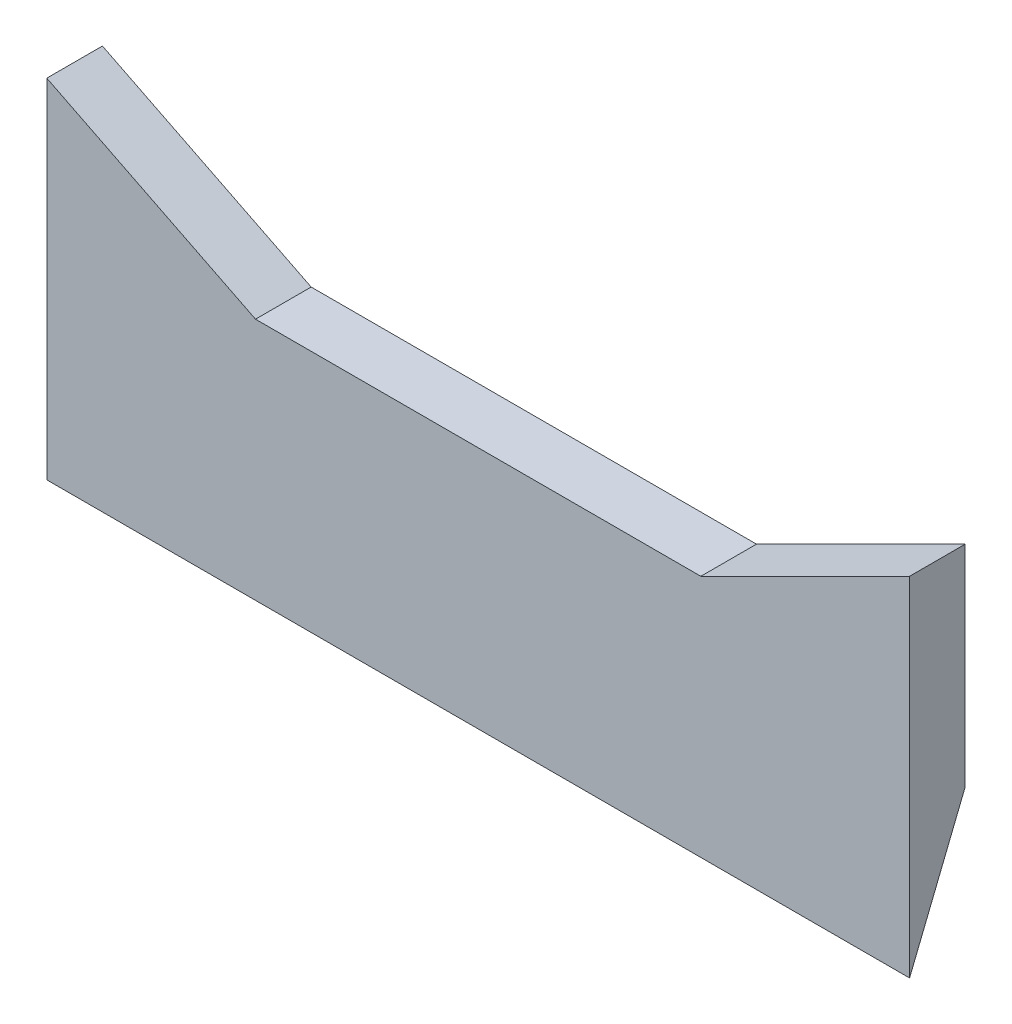
ISO-10303-21;
HEADER;
FILE_DESCRIPTION(('STEP AP214'),'2;1');
FILE_NAME('part.step','',(''),(''),'','','');
FILE_SCHEMA(('AUTOMOTIVE_DESIGN { 1 0 10303 214 1 1 1 1 }'));
ENDSEC;
DATA;
#1=APPLICATION_CONTEXT('core data for automotive mechanical design processes');
#2=APPLICATION_PROTOCOL_DEFINITION('international standard','automotive_design',2000,#1);
#3=PRODUCT_CONTEXT('',#1,'mechanical');
#4=PRODUCT('Part','Part','',(#3));
#5=PRODUCT_RELATED_PRODUCT_CATEGORY('part','',(#4));
#6=PRODUCT_DEFINITION_FORMATION('','',#4);
#7=PRODUCT_DEFINITION_CONTEXT('part definition',#1,'design');
#8=PRODUCT_DEFINITION('design','',#6,#7);
#9=PRODUCT_DEFINITION_SHAPE('','',#8);
#10=(LENGTH_UNIT() NAMED_UNIT(*) SI_UNIT(.MILLI.,.METRE.));
#11=(NAMED_UNIT(*) PLANE_ANGLE_UNIT() SI_UNIT($,.RADIAN.));
#12=(NAMED_UNIT(*) SI_UNIT($,.STERADIAN.) SOLID_ANGLE_UNIT());
#13=UNCERTAINTY_MEASURE_WITH_UNIT(LENGTH_MEASURE(1.E-05),#10,'distance_accuracy_value','');
#14=(GEOMETRIC_REPRESENTATION_CONTEXT(3) GLOBAL_UNCERTAINTY_ASSIGNED_CONTEXT((#13)) GLOBAL_UNIT_ASSIGNED_CONTEXT((#10,
#11,#12)) REPRESENTATION_CONTEXT('',''));
#15=CARTESIAN_POINT('',(0.,0.,0.));
#16=DIRECTION('',(0.,0.,1.));
#17=DIRECTION('',(1.,0.,0.));
#18=AXIS2_PLACEMENT_3D('',#15,#16,#17);
#19=CARTESIAN_POINT('',(0.,50.,8.));
#20=DIRECTION('',(1.,0.,0.));
#21=DIRECTION('',(0.,1.,0.));
#22=AXIS2_PLACEMENT_3D('',#19,#20,#21);
#23=PLANE('',#22);
#24=DIRECTION('',(0.,-1.,0.));
#25=VECTOR('',#24,1.);
#26=CARTESIAN_POINT('',(0.,50.,0.));
#27=LINE('',#26,#25);
#28=CARTESIAN_POINT('',(0.,50.,0.));
#29=VERTEX_POINT('',#28);
#30=CARTESIAN_POINT('',(0.,19.8006948273313,0.));
#31=VERTEX_POINT('',#30);
#32=EDGE_CURVE('E101',#29,#31,#27,.T.);
#33=ORIENTED_EDGE('',*,*,#32,.T.);
#34=DIRECTION('',(0.,0.927183854566793,-0.374606593415897));
#35=VECTOR('',#34,1.);
#36=CARTESIAN_POINT('',(0.,19.8006948273313,0.));
#37=LINE('',#36,#35);
#38=CARTESIAN_POINT('',(0.,0.,8.00000000000001));
#39=VERTEX_POINT('',#38);
#40=EDGE_CURVE('E48',#39,#31,#37,.T.);
#41=ORIENTED_EDGE('',*,*,#40,.F.);
#42=DIRECTION('',(0.,-1.,0.));
#43=VECTOR('',#42,1.);
#44=CARTESIAN_POINT('',(0.,50.,8.));
#45=LINE('',#44,#43);
#46=CARTESIAN_POINT('',(0.,50.,8.));
#47=VERTEX_POINT('',#46);
#48=EDGE_CURVE('E119',#47,#39,#45,.T.);
#49=ORIENTED_EDGE('',*,*,#48,.F.);
#50=DIRECTION('',(0.,0.,-1.));
#51=VECTOR('',#50,1.);
#52=CARTESIAN_POINT('',(0.,50.,8.));
#53=LINE('',#52,#51);
#54=EDGE_CURVE('E120',#47,#29,#53,.T.);
#55=ORIENTED_EDGE('',*,*,#54,.T.);
#56=EDGE_LOOP('',(#33,#41,#49,#55));
#57=FACE_BOUND('',#56,.T.);
#58=ADVANCED_FACE('F34',(#57),#23,.F.);
#59=CARTESIAN_POINT('',(124.,0.,8.));
#60=DIRECTION('',(-1.,0.,0.));
#61=DIRECTION('',(0.,0.,1.));
#62=AXIS2_PLACEMENT_3D('',#59,#60,#61);
#63=PLANE('',#62);
#64=DIRECTION('',(0.,1.,0.));
#65=VECTOR('',#64,1.);
#66=CARTESIAN_POINT('',(124.,0.,8.));
#67=LINE('',#66,#65);
#68=CARTESIAN_POINT('',(124.,0.,8.00000000000001));
#69=VERTEX_POINT('',#68);
#70=CARTESIAN_POINT('',(124.,50.,8.));
#71=VERTEX_POINT('',#70);
#72=EDGE_CURVE('E85',#69,#71,#67,.T.);
#73=ORIENTED_EDGE('',*,*,#72,.F.);
#74=DIRECTION('',(0.,0.927183854566793,-0.374606593415897));
#75=VECTOR('',#74,1.);
#76=CARTESIAN_POINT('',(124.,19.8006948273313,0.));
#77=LINE('',#76,#75);
#78=CARTESIAN_POINT('',(124.,19.8006948273313,0.));
#79=VERTEX_POINT('',#78);
#80=EDGE_CURVE('E96',#69,#79,#77,.T.);
#81=ORIENTED_EDGE('',*,*,#80,.T.);
#82=DIRECTION('',(0.,1.,0.));
#83=VECTOR('',#82,1.);
#84=CARTESIAN_POINT('',(124.,0.,0.));
#85=LINE('',#84,#83);
#86=CARTESIAN_POINT('',(124.,50.,0.));
#87=VERTEX_POINT('',#86);
#88=EDGE_CURVE('E105',#79,#87,#85,.T.);
#89=ORIENTED_EDGE('',*,*,#88,.T.);
#90=DIRECTION('',(0.,0.,-1.));
#91=VECTOR('',#90,1.);
#92=CARTESIAN_POINT('',(124.,50.,8.));
#93=LINE('',#92,#91);
#94=EDGE_CURVE('E11',#71,#87,#93,.T.);
#95=ORIENTED_EDGE('',*,*,#94,.F.);
#96=EDGE_LOOP('',(#73,#81,#89,#95));
#97=FACE_BOUND('',#96,.T.);
#98=ADVANCED_FACE('F104',(#97),#63,.F.);
#99=CARTESIAN_POINT('',(124.,50.,8.));
#100=DIRECTION('',(0.447213595499958,-0.894427190999916,0.));
#101=DIRECTION('',(0.894427190999916,0.447213595499958,0.));
#102=AXIS2_PLACEMENT_3D('',#99,#100,#101);
#103=PLANE('',#102);
#104=DIRECTION('',(-0.894427190999916,-0.447213595499958,0.));
#105=VECTOR('',#104,1.);
#106=CARTESIAN_POINT('',(124.,50.,0.));
#107=LINE('',#106,#105);
#108=CARTESIAN_POINT('',(94.,35.,0.));
#109=VERTEX_POINT('',#108);
#110=EDGE_CURVE('E110',#87,#109,#107,.T.);
#111=ORIENTED_EDGE('',*,*,#110,.T.);
#112=DIRECTION('',(0.,0.,-1.));
#113=VECTOR('',#112,1.);
#114=CARTESIAN_POINT('',(94.,35.,8.));
#115=LINE('',#114,#113);
#116=CARTESIAN_POINT('',(94.,35.,8.));
#117=VERTEX_POINT('',#116);
#118=EDGE_CURVE('E41',#117,#109,#115,.T.);
#119=ORIENTED_EDGE('',*,*,#118,.F.);
#120=DIRECTION('',(-0.894427190999916,-0.447213595499958,0.));
#121=VECTOR('',#120,1.);
#122=CARTESIAN_POINT('',(124.,50.,8.));
#123=LINE('',#122,#121);
#124=EDGE_CURVE('E135',#71,#117,#123,.T.);
#125=ORIENTED_EDGE('',*,*,#124,.F.);
#126=ORIENTED_EDGE('',*,*,#94,.T.);
#127=EDGE_LOOP('',(#111,#119,#125,#126));
#128=FACE_BOUND('',#127,.T.);
#129=ADVANCED_FACE('F157',(#128),#103,.F.);
#130=CARTESIAN_POINT('',(94.,35.,8.));
#131=DIRECTION('',(0.,-1.,0.));
#132=DIRECTION('',(1.,0.,0.));
#133=AXIS2_PLACEMENT_3D('',#130,#131,#132);
#134=PLANE('',#133);
#135=DIRECTION('',(-1.,0.,0.));
#136=VECTOR('',#135,1.);
#137=CARTESIAN_POINT('',(94.,35.,0.));
#138=LINE('',#137,#136);
#139=CARTESIAN_POINT('',(30.,35.,0.));
#140=VERTEX_POINT('',#139);
#141=EDGE_CURVE('E112',#109,#140,#138,.T.);
#142=ORIENTED_EDGE('',*,*,#141,.T.);
#143=DIRECTION('',(0.,0.,-1.));
#144=VECTOR('',#143,1.);
#145=CARTESIAN_POINT('',(30.,35.,8.));
#146=LINE('',#145,#144);
#147=CARTESIAN_POINT('',(30.,35.,8.));
#148=VERTEX_POINT('',#147);
#149=EDGE_CURVE('E122',#148,#140,#146,.T.);
#150=ORIENTED_EDGE('',*,*,#149,.F.);
#151=DIRECTION('',(-1.,0.,0.));
#152=VECTOR('',#151,1.);
#153=CARTESIAN_POINT('',(94.,35.,8.));
#154=LINE('',#153,#152);
#155=EDGE_CURVE('E129',#117,#148,#154,.T.);
#156=ORIENTED_EDGE('',*,*,#155,.F.);
#157=ORIENTED_EDGE('',*,*,#118,.T.);
#158=EDGE_LOOP('',(#142,#150,#156,#157));
#159=FACE_BOUND('',#158,.T.);
#160=ADVANCED_FACE('F127',(#159),#134,.F.);
#161=CARTESIAN_POINT('',(30.,35.,8.));
#162=DIRECTION('',(-0.447213595499958,-0.894427190999916,0.));
#163=DIRECTION('',(0.894427190999916,-0.447213595499958,0.));
#164=AXIS2_PLACEMENT_3D('',#161,#162,#163);
#165=PLANE('',#164);
#166=DIRECTION('',(-0.894427190999916,0.447213595499958,0.));
#167=VECTOR('',#166,1.);
#168=CARTESIAN_POINT('',(30.,35.,0.));
#169=LINE('',#168,#167);
#170=EDGE_CURVE('E78',#140,#29,#169,.T.);
#171=ORIENTED_EDGE('',*,*,#170,.T.);
#172=ORIENTED_EDGE('',*,*,#54,.F.);
#173=DIRECTION('',(-0.894427190999916,0.447213595499958,0.));
#174=VECTOR('',#173,1.);
#175=CARTESIAN_POINT('',(30.,35.,8.));
#176=LINE('',#175,#174);
#177=EDGE_CURVE('E57',#148,#47,#176,.T.);
#178=ORIENTED_EDGE('',*,*,#177,.F.);
#179=ORIENTED_EDGE('',*,*,#149,.T.);
#180=EDGE_LOOP('',(#171,#172,#178,#179));
#181=FACE_BOUND('',#180,.T.);
#182=ADVANCED_FACE('F134',(#181),#165,.F.);
#183=CARTESIAN_POINT('',(0.,0.,8.));
#184=DIRECTION('',(0.,0.,1.));
#185=DIRECTION('',(1.,0.,0.));
#186=AXIS2_PLACEMENT_3D('',#183,#184,#185);
#187=PLANE('',#186);
#188=ORIENTED_EDGE('',*,*,#48,.T.);
#189=DIRECTION('',(1.,0.,0.));
#190=VECTOR('',#189,1.);
#191=CARTESIAN_POINT('',(0.,0.,8.));
#192=LINE('',#191,#190);
#193=EDGE_CURVE('E140',#39,#69,#192,.T.);
#194=ORIENTED_EDGE('',*,*,#193,.T.);
#195=ORIENTED_EDGE('',*,*,#72,.T.);
#196=ORIENTED_EDGE('',*,*,#124,.T.);
#197=ORIENTED_EDGE('',*,*,#155,.T.);
#198=ORIENTED_EDGE('',*,*,#177,.T.);
#199=EDGE_LOOP('',(#188,#194,#195,#196,#197,#198));
#200=FACE_BOUND('',#199,.T.);
#201=ADVANCED_FACE('F143',(#200),#187,.T.);
#202=CARTESIAN_POINT('',(0.,0.,0.));
#203=DIRECTION('',(0.,0.,1.));
#204=DIRECTION('',(1.,0.,0.));
#205=AXIS2_PLACEMENT_3D('',#202,#203,#204);
#206=PLANE('',#205);
#207=ORIENTED_EDGE('',*,*,#88,.F.);
#208=DIRECTION('',(-1.,0.,0.));
#209=VECTOR('',#208,1.);
#210=CARTESIAN_POINT('',(124.,19.8006948273313,0.));
#211=LINE('',#210,#209);
#212=EDGE_CURVE('E93',#79,#31,#211,.T.);
#213=ORIENTED_EDGE('',*,*,#212,.T.);
#214=ORIENTED_EDGE('',*,*,#32,.F.);
#215=ORIENTED_EDGE('',*,*,#170,.F.);
#216=ORIENTED_EDGE('',*,*,#141,.F.);
#217=ORIENTED_EDGE('',*,*,#110,.F.);
#218=EDGE_LOOP('',(#207,#213,#214,#215,#216,#217));
#219=FACE_BOUND('',#218,.T.);
#220=ADVANCED_FACE('F108',(#219),#206,.F.);
#221=CARTESIAN_POINT('',(124.,19.8006948273313,0.));
#222=DIRECTION('',(0.,0.374606593415897,0.927183854566793));
#223=DIRECTION('',(0.,-0.927183854566793,0.374606593415897));
#224=AXIS2_PLACEMENT_3D('',#221,#222,#223);
#225=PLANE('',#224);
#226=ORIENTED_EDGE('',*,*,#40,.T.);
#227=ORIENTED_EDGE('',*,*,#212,.F.);
#228=ORIENTED_EDGE('',*,*,#80,.F.);
#229=ORIENTED_EDGE('',*,*,#193,.F.);
#230=EDGE_LOOP('',(#226,#227,#228,#229));
#231=FACE_BOUND('',#230,.T.);
#232=ADVANCED_FACE('F95',(#231),#225,.F.);
#233=CLOSED_SHELL('',(#58,#98,#129,#160,#182,#201,#220,#232));
#234=MANIFOLD_SOLID_BREP('B2',#233);
#235=ADVANCED_BREP_SHAPE_REPRESENTATION('',(#18,#234),#14);
#236=SHAPE_DEFINITION_REPRESENTATION(#9,#235);
ENDSEC;
END-ISO-10303-21;
